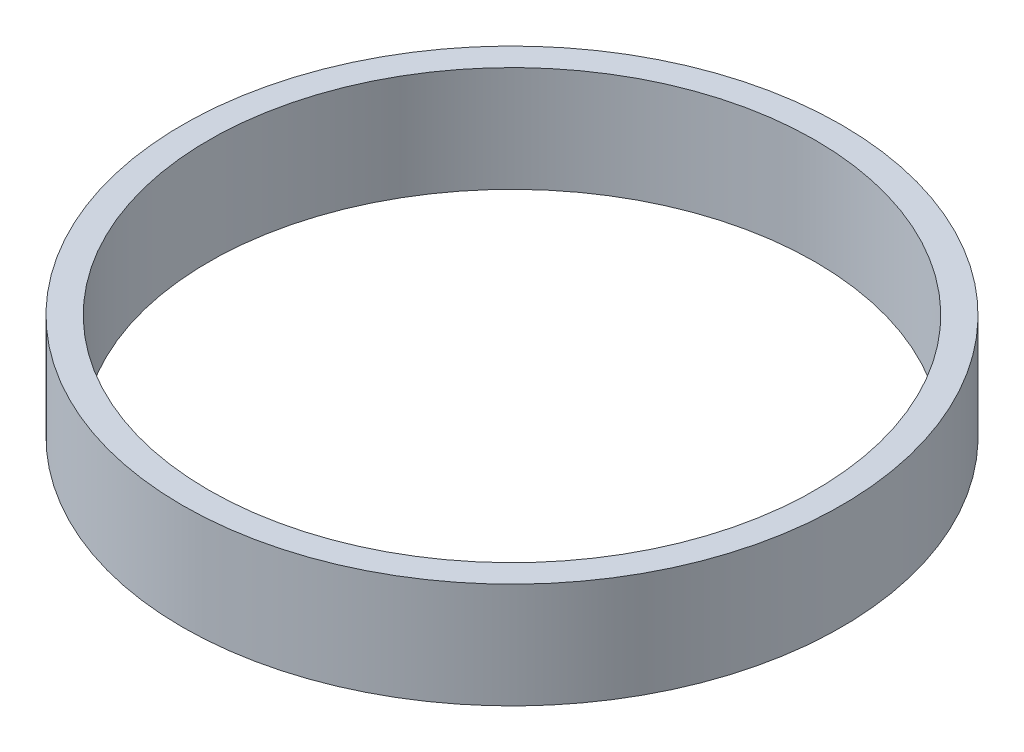
ISO-10303-21;
HEADER;
FILE_DESCRIPTION(('STEP AP214'),'2;1');
FILE_NAME('part.step','',(''),(''),'','','');
FILE_SCHEMA(('AUTOMOTIVE_DESIGN { 1 0 10303 214 1 1 1 1 }'));
ENDSEC;
DATA;
#1=APPLICATION_CONTEXT('core data for automotive mechanical design processes');
#2=APPLICATION_PROTOCOL_DEFINITION('international standard','automotive_design',2000,#1);
#3=PRODUCT_CONTEXT('',#1,'mechanical');
#4=PRODUCT('Part','Part','',(#3));
#5=PRODUCT_RELATED_PRODUCT_CATEGORY('part','',(#4));
#6=PRODUCT_DEFINITION_FORMATION('','',#4);
#7=PRODUCT_DEFINITION_CONTEXT('part definition',#1,'design');
#8=PRODUCT_DEFINITION('design','',#6,#7);
#9=PRODUCT_DEFINITION_SHAPE('','',#8);
#10=(LENGTH_UNIT() NAMED_UNIT(*) SI_UNIT(.MILLI.,.METRE.));
#11=(NAMED_UNIT(*) PLANE_ANGLE_UNIT() SI_UNIT($,.RADIAN.));
#12=(NAMED_UNIT(*) SI_UNIT($,.STERADIAN.) SOLID_ANGLE_UNIT());
#13=UNCERTAINTY_MEASURE_WITH_UNIT(LENGTH_MEASURE(1.E-05),#10,'distance_accuracy_value','');
#14=(GEOMETRIC_REPRESENTATION_CONTEXT(3) GLOBAL_UNCERTAINTY_ASSIGNED_CONTEXT((#13)) GLOBAL_UNIT_ASSIGNED_CONTEXT((#10,
#11,#12)) REPRESENTATION_CONTEXT('',''));
#15=CARTESIAN_POINT('',(0.,0.,0.));
#16=DIRECTION('',(0.,0.,1.));
#17=DIRECTION('',(1.,0.,0.));
#18=AXIS2_PLACEMENT_3D('',#15,#16,#17);
#19=CARTESIAN_POINT('',(0.,2.,0.));
#20=DIRECTION('',(0.,1.,0.));
#21=DIRECTION('',(0.,0.,1.));
#22=AXIS2_PLACEMENT_3D('',#19,#20,#21);
#23=PLANE('',#22);
#24=CARTESIAN_POINT('',(0.,2.,0.));
#25=DIRECTION('',(0.,1.,0.));
#26=DIRECTION('',(0.,0.,1.));
#27=AXIS2_PLACEMENT_3D('',#24,#25,#26);
#28=CIRCLE('',#27,6.25);
#29=CARTESIAN_POINT('',(0.,2.,6.25));
#30=VERTEX_POINT('',#29);
#31=EDGE_CURVE('E10',#30,#30,#28,.T.);
#32=ORIENTED_EDGE('',*,*,#31,.T.);
#33=EDGE_LOOP('',(#32));
#34=FACE_BOUND('',#33,.T.);
#35=CARTESIAN_POINT('',(0.,2.,0.));
#36=DIRECTION('',(0.,1.,0.));
#37=DIRECTION('',(0.,0.,1.));
#38=AXIS2_PLACEMENT_3D('',#35,#36,#37);
#39=CIRCLE('',#38,5.75);
#40=CARTESIAN_POINT('',(0.,2.,5.75));
#41=VERTEX_POINT('',#40);
#42=EDGE_CURVE('E42',#41,#41,#39,.T.);
#43=ORIENTED_EDGE('',*,*,#42,.F.);
#44=EDGE_LOOP('',(#43));
#45=FACE_BOUND('',#44,.T.);
#46=ADVANCED_FACE('F31',(#34,#45),#23,.T.);
#47=CARTESIAN_POINT('',(0.,0.,0.));
#48=DIRECTION('',(0.,1.,0.));
#49=DIRECTION('',(0.,0.,1.));
#50=AXIS2_PLACEMENT_3D('',#47,#48,#49);
#51=PLANE('',#50);
#52=CARTESIAN_POINT('',(0.,0.,0.));
#53=DIRECTION('',(0.,1.,0.));
#54=DIRECTION('',(0.,0.,1.));
#55=AXIS2_PLACEMENT_3D('',#52,#53,#54);
#56=CIRCLE('',#55,6.25);
#57=CARTESIAN_POINT('',(0.,0.,6.25));
#58=VERTEX_POINT('',#57);
#59=EDGE_CURVE('E35',#58,#58,#56,.T.);
#60=ORIENTED_EDGE('',*,*,#59,.F.);
#61=EDGE_LOOP('',(#60));
#62=FACE_BOUND('',#61,.T.);
#63=CARTESIAN_POINT('',(0.,0.,0.));
#64=DIRECTION('',(0.,1.,0.));
#65=DIRECTION('',(0.,0.,1.));
#66=AXIS2_PLACEMENT_3D('',#63,#64,#65);
#67=CIRCLE('',#66,5.75);
#68=CARTESIAN_POINT('',(0.,0.,5.75));
#69=VERTEX_POINT('',#68);
#70=EDGE_CURVE('E44',#69,#69,#67,.T.);
#71=ORIENTED_EDGE('',*,*,#70,.T.);
#72=EDGE_LOOP('',(#71));
#73=FACE_BOUND('',#72,.T.);
#74=ADVANCED_FACE('F54',(#62,#73),#51,.F.);
#75=CARTESIAN_POINT('',(0.,2.,0.));
#76=DIRECTION('',(0.,-1.,0.));
#77=DIRECTION('',(0.,0.,-1.));
#78=AXIS2_PLACEMENT_3D('',#75,#76,#77);
#79=CYLINDRICAL_SURFACE('',#78,6.25);
#80=ORIENTED_EDGE('',*,*,#31,.F.);
#81=EDGE_LOOP('',(#80));
#82=FACE_BOUND('',#81,.T.);
#83=ORIENTED_EDGE('',*,*,#59,.T.);
#84=EDGE_LOOP('',(#83));
#85=FACE_BOUND('',#84,.T.);
#86=ADVANCED_FACE('F33',(#82,#85),#79,.T.);
#87=CARTESIAN_POINT('',(0.,2.,0.));
#88=DIRECTION('',(0.,-1.,0.));
#89=DIRECTION('',(0.,0.,-1.));
#90=AXIS2_PLACEMENT_3D('',#87,#88,#89);
#91=CYLINDRICAL_SURFACE('',#90,5.75);
#92=ORIENTED_EDGE('',*,*,#42,.T.);
#93=EDGE_LOOP('',(#92));
#94=FACE_BOUND('',#93,.T.);
#95=ORIENTED_EDGE('',*,*,#70,.F.);
#96=EDGE_LOOP('',(#95));
#97=FACE_BOUND('',#96,.T.);
#98=ADVANCED_FACE('F50',(#94,#97),#91,.F.);
#99=CLOSED_SHELL('',(#46,#74,#86,#98));
#100=MANIFOLD_SOLID_BREP('B2',#99);
#101=ADVANCED_BREP_SHAPE_REPRESENTATION('',(#18,#100),#14);
#102=SHAPE_DEFINITION_REPRESENTATION(#9,#101);
ENDSEC;
END-ISO-10303-21;
